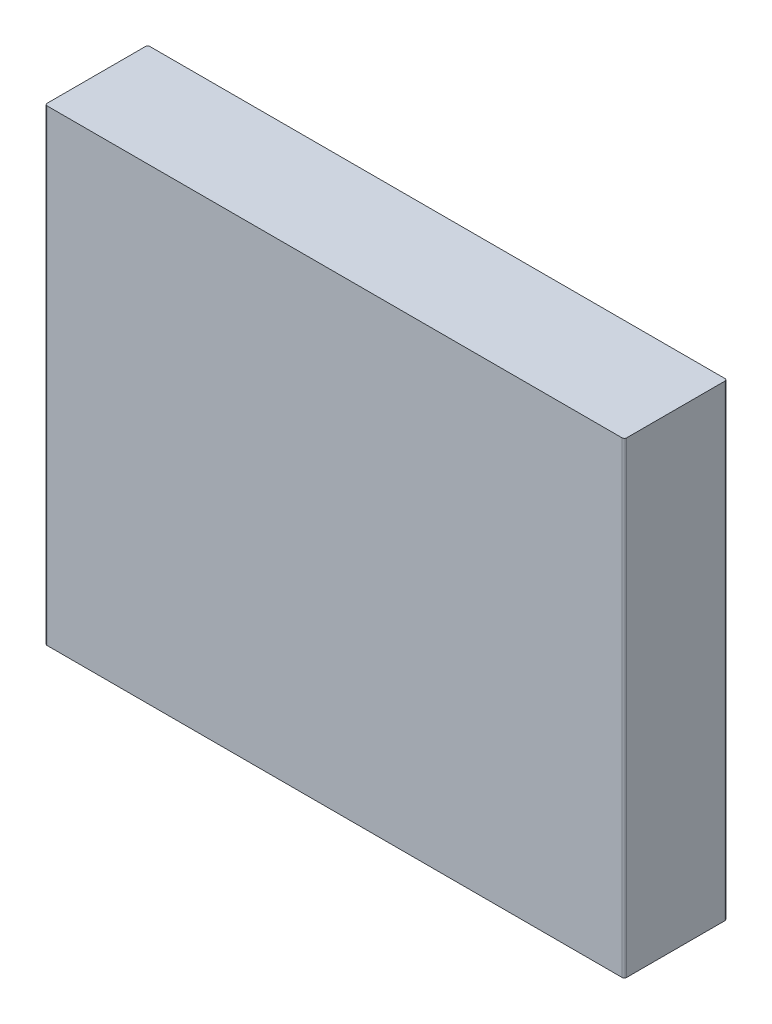
ISO-10303-21;
HEADER;
FILE_DESCRIPTION(('STEP AP214'),'2;1');
FILE_NAME('part.step','',(''),(''),'','','');
FILE_SCHEMA(('AUTOMOTIVE_DESIGN { 1 0 10303 214 1 1 1 1 }'));
ENDSEC;
DATA;
#1=APPLICATION_CONTEXT('core data for automotive mechanical design processes');
#2=APPLICATION_PROTOCOL_DEFINITION('international standard','automotive_design',2000,#1);
#3=PRODUCT_CONTEXT('',#1,'mechanical');
#4=PRODUCT('Part','Part','',(#3));
#5=PRODUCT_RELATED_PRODUCT_CATEGORY('part','',(#4));
#6=PRODUCT_DEFINITION_FORMATION('','',#4);
#7=PRODUCT_DEFINITION_CONTEXT('part definition',#1,'design');
#8=PRODUCT_DEFINITION('design','',#6,#7);
#9=PRODUCT_DEFINITION_SHAPE('','',#8);
#10=(LENGTH_UNIT() NAMED_UNIT(*) SI_UNIT(.MILLI.,.METRE.));
#11=(NAMED_UNIT(*) PLANE_ANGLE_UNIT() SI_UNIT($,.RADIAN.));
#12=(NAMED_UNIT(*) SI_UNIT($,.STERADIAN.) SOLID_ANGLE_UNIT());
#13=UNCERTAINTY_MEASURE_WITH_UNIT(LENGTH_MEASURE(1.E-05),#10,'distance_accuracy_value','');
#14=(GEOMETRIC_REPRESENTATION_CONTEXT(3) GLOBAL_UNCERTAINTY_ASSIGNED_CONTEXT((#13)) GLOBAL_UNIT_ASSIGNED_CONTEXT((#10,
#11,#12)) REPRESENTATION_CONTEXT('',''));
#15=CARTESIAN_POINT('',(0.,0.,0.));
#16=DIRECTION('',(0.,0.,1.));
#17=DIRECTION('',(1.,0.,0.));
#18=AXIS2_PLACEMENT_3D('',#15,#16,#17);
#19=CARTESIAN_POINT('',(0.,0.,0.6));
#20=DIRECTION('',(0.,0.,-1.));
#21=DIRECTION('',(0.,-1.,0.));
#22=AXIS2_PLACEMENT_3D('',#19,#20,#21);
#23=PLANE('',#22);
#24=DIRECTION('',(0.,1.,0.));
#25=VECTOR('',#24,1.);
#26=CARTESIAN_POINT('',(-1.5375,-0.625,0.6));
#27=LINE('',#26,#25);
#28=CARTESIAN_POINT('',(-1.5375,-1.25,0.6));
#29=VERTEX_POINT('',#28);
#30=CARTESIAN_POINT('',(-1.5375,1.25,0.6));
#31=VERTEX_POINT('',#30);
#32=EDGE_CURVE('E139',#29,#31,#27,.T.);
#33=ORIENTED_EDGE('',*,*,#32,.F.);
#34=DIRECTION('',(1.,0.,0.));
#35=VECTOR('',#34,1.);
#36=CARTESIAN_POINT('',(-1.55,-1.25,0.6));
#37=LINE('',#36,#35);
#38=CARTESIAN_POINT('',(1.5375,-1.25,0.6));
#39=VERTEX_POINT('',#38);
#40=EDGE_CURVE('E11',#29,#39,#37,.T.);
#41=ORIENTED_EDGE('',*,*,#40,.T.);
#42=DIRECTION('',(0.,-1.,0.));
#43=VECTOR('',#42,1.);
#44=CARTESIAN_POINT('',(1.5375,0.625,0.6));
#45=LINE('',#44,#43);
#46=CARTESIAN_POINT('',(1.5375,1.25,0.6));
#47=VERTEX_POINT('',#46);
#48=EDGE_CURVE('E141',#47,#39,#45,.T.);
#49=ORIENTED_EDGE('',*,*,#48,.F.);
#50=DIRECTION('',(-1.,0.,0.));
#51=VECTOR('',#50,1.);
#52=CARTESIAN_POINT('',(1.55,1.25,0.6));
#53=LINE('',#52,#51);
#54=EDGE_CURVE('E129',#47,#31,#53,.T.);
#55=ORIENTED_EDGE('',*,*,#54,.T.);
#56=EDGE_LOOP('',(#33,#41,#49,#55));
#57=FACE_BOUND('',#56,.T.);
#58=ADVANCED_FACE('F16',(#57),#23,.F.);
#59=CARTESIAN_POINT('',(1.55,-1.25,0.6));
#60=DIRECTION('',(0.,-1.,0.));
#61=DIRECTION('',(0.,0.,-1.));
#62=AXIS2_PLACEMENT_3D('',#59,#60,#61);
#63=PLANE('',#62);
#64=CARTESIAN_POINT('',(-1.5375,-1.25,0.5875));
#65=DIRECTION('',(0.,1.,0.));
#66=DIRECTION('',(-0.707106781186548,0.,0.707106781186548));
#67=AXIS2_PLACEMENT_3D('',#64,#65,#66);
#68=CIRCLE('',#67,0.0125);
#69=CARTESIAN_POINT('',(-1.55,-1.25,0.5875));
#70=VERTEX_POINT('',#69);
#71=EDGE_CURVE('E188',#70,#29,#68,.T.);
#72=ORIENTED_EDGE('',*,*,#71,.F.);
#73=DIRECTION('',(0.,0.,-1.));
#74=VECTOR('',#73,1.);
#75=CARTESIAN_POINT('',(-1.55,-1.25,0.6));
#76=LINE('',#75,#74);
#77=CARTESIAN_POINT('',(-1.55,-1.25,0.0625));
#78=VERTEX_POINT('',#77);
#79=EDGE_CURVE('E136',#70,#78,#76,.T.);
#80=ORIENTED_EDGE('',*,*,#79,.T.);
#81=CARTESIAN_POINT('',(-1.5375,-1.25,0.0625));
#82=DIRECTION('',(0.,1.,0.));
#83=DIRECTION('',(-0.707106781186548,0.,-0.707106781186548));
#84=AXIS2_PLACEMENT_3D('',#81,#82,#83);
#85=CIRCLE('',#84,0.0125);
#86=CARTESIAN_POINT('',(-1.5375,-1.25,0.05));
#87=VERTEX_POINT('',#86);
#88=EDGE_CURVE('E155',#87,#78,#85,.T.);
#89=ORIENTED_EDGE('',*,*,#88,.F.);
#90=DIRECTION('',(-1.,0.,0.));
#91=VECTOR('',#90,1.);
#92=CARTESIAN_POINT('',(-1.55,-1.25,0.05));
#93=LINE('',#92,#91);
#94=CARTESIAN_POINT('',(1.5375,-1.25,0.05));
#95=VERTEX_POINT('',#94);
#96=EDGE_CURVE('E154',#95,#87,#93,.T.);
#97=ORIENTED_EDGE('',*,*,#96,.F.);
#98=CARTESIAN_POINT('',(1.5375,-1.25,0.0625));
#99=DIRECTION('',(0.,1.,0.));
#100=DIRECTION('',(0.707106781186548,0.,-0.707106781186548));
#101=AXIS2_PLACEMENT_3D('',#98,#99,#100);
#102=CIRCLE('',#101,0.0125);
#103=CARTESIAN_POINT('',(1.55,-1.25,0.0625));
#104=VERTEX_POINT('',#103);
#105=EDGE_CURVE('E109',#104,#95,#102,.T.);
#106=ORIENTED_EDGE('',*,*,#105,.F.);
#107=DIRECTION('',(0.,0.,-1.));
#108=VECTOR('',#107,1.);
#109=CARTESIAN_POINT('',(1.55,-1.25,0.6));
#110=LINE('',#109,#108);
#111=CARTESIAN_POINT('',(1.55,-1.25,0.5875));
#112=VERTEX_POINT('',#111);
#113=EDGE_CURVE('E103',#112,#104,#110,.T.);
#114=ORIENTED_EDGE('',*,*,#113,.F.);
#115=CARTESIAN_POINT('',(1.5375,-1.25,0.5875));
#116=DIRECTION('',(0.,1.,0.));
#117=DIRECTION('',(0.707106781186548,0.,0.707106781186548));
#118=AXIS2_PLACEMENT_3D('',#115,#116,#117);
#119=CIRCLE('',#118,0.0125);
#120=EDGE_CURVE('E27',#39,#112,#119,.T.);
#121=ORIENTED_EDGE('',*,*,#120,.F.);
#122=ORIENTED_EDGE('',*,*,#40,.F.);
#123=EDGE_LOOP('',(#72,#80,#89,#97,#106,#114,#121,#122));
#124=FACE_BOUND('',#123,.T.);
#125=ADVANCED_FACE('F184',(#124),#63,.T.);
#126=CARTESIAN_POINT('',(1.5375,0.625,0.5875));
#127=DIRECTION('',(0.,1.,0.));
#128=DIRECTION('',(0.707106781186548,0.,0.707106781186548));
#129=AXIS2_PLACEMENT_3D('',#126,#127,#128);
#130=CYLINDRICAL_SURFACE('',#129,0.0125);
#131=CARTESIAN_POINT('',(1.5375,1.25,0.5875));
#132=DIRECTION('',(0.,-1.,0.));
#133=DIRECTION('',(0.707106781186548,0.,0.707106781186548));
#134=AXIS2_PLACEMENT_3D('',#131,#132,#133);
#135=CIRCLE('',#134,0.0125);
#136=CARTESIAN_POINT('',(1.55,1.25,0.5875));
#137=VERTEX_POINT('',#136);
#138=EDGE_CURVE('E123',#137,#47,#135,.T.);
#139=ORIENTED_EDGE('',*,*,#138,.T.);
#140=ORIENTED_EDGE('',*,*,#48,.T.);
#141=ORIENTED_EDGE('',*,*,#120,.T.);
#142=DIRECTION('',(0.,1.,0.));
#143=VECTOR('',#142,1.);
#144=CARTESIAN_POINT('',(1.55,0.625,0.5875));
#145=LINE('',#144,#143);
#146=EDGE_CURVE('E108',#112,#137,#145,.T.);
#147=ORIENTED_EDGE('',*,*,#146,.T.);
#148=EDGE_LOOP('',(#139,#140,#141,#147));
#149=FACE_BOUND('',#148,.T.);
#150=ADVANCED_FACE('F242',(#149),#130,.T.);
#151=CARTESIAN_POINT('',(1.55,1.25,0.6));
#152=DIRECTION('',(1.,0.,0.));
#153=DIRECTION('',(0.,0.,1.));
#154=AXIS2_PLACEMENT_3D('',#151,#152,#153);
#155=PLANE('',#154);
#156=DIRECTION('',(0.,-1.,0.));
#157=VECTOR('',#156,1.);
#158=CARTESIAN_POINT('',(1.55,0.625,0.0625));
#159=LINE('',#158,#157);
#160=CARTESIAN_POINT('',(1.55,1.25,0.0625));
#161=VERTEX_POINT('',#160);
#162=EDGE_CURVE('E96',#161,#104,#159,.T.);
#163=ORIENTED_EDGE('',*,*,#162,.F.);
#164=DIRECTION('',(0.,0.,-1.));
#165=VECTOR('',#164,1.);
#166=CARTESIAN_POINT('',(1.55,1.25,0.6));
#167=LINE('',#166,#165);
#168=EDGE_CURVE('E20',#137,#161,#167,.T.);
#169=ORIENTED_EDGE('',*,*,#168,.F.);
#170=ORIENTED_EDGE('',*,*,#146,.F.);
#171=ORIENTED_EDGE('',*,*,#113,.T.);
#172=EDGE_LOOP('',(#163,#169,#170,#171));
#173=FACE_BOUND('',#172,.T.);
#174=ADVANCED_FACE('F98',(#173),#155,.T.);
#175=CARTESIAN_POINT('',(1.5375,0.625,0.0625));
#176=DIRECTION('',(0.,-1.,0.));
#177=DIRECTION('',(0.707106781186548,0.,-0.707106781186548));
#178=AXIS2_PLACEMENT_3D('',#175,#176,#177);
#179=CYLINDRICAL_SURFACE('',#178,0.0125);
#180=ORIENTED_EDGE('',*,*,#105,.T.);
#181=DIRECTION('',(0.,1.,0.));
#182=VECTOR('',#181,1.);
#183=CARTESIAN_POINT('',(1.5375,0.625,0.05));
#184=LINE('',#183,#182);
#185=CARTESIAN_POINT('',(1.5375,1.25,0.05));
#186=VERTEX_POINT('',#185);
#187=EDGE_CURVE('E115',#95,#186,#184,.T.);
#188=ORIENTED_EDGE('',*,*,#187,.T.);
#189=CARTESIAN_POINT('',(1.5375,1.25,0.0625));
#190=DIRECTION('',(0.,-1.,0.));
#191=DIRECTION('',(0.707106781186548,0.,-0.707106781186548));
#192=AXIS2_PLACEMENT_3D('',#189,#190,#191);
#193=CIRCLE('',#192,0.0125);
#194=EDGE_CURVE('E112',#186,#161,#193,.T.);
#195=ORIENTED_EDGE('',*,*,#194,.T.);
#196=ORIENTED_EDGE('',*,*,#162,.T.);
#197=EDGE_LOOP('',(#180,#188,#195,#196));
#198=FACE_BOUND('',#197,.T.);
#199=ADVANCED_FACE('F113',(#198),#179,.T.);
#200=CARTESIAN_POINT('',(0.,0.,0.05));
#201=DIRECTION('',(0.,0.,-1.));
#202=DIRECTION('',(0.,-1.,0.));
#203=AXIS2_PLACEMENT_3D('',#200,#201,#202);
#204=PLANE('',#203);
#205=DIRECTION('',(0.,-1.,0.));
#206=VECTOR('',#205,1.);
#207=CARTESIAN_POINT('',(-1.5375,-0.625,0.05));
#208=LINE('',#207,#206);
#209=CARTESIAN_POINT('',(-1.5375,1.25,0.05));
#210=VERTEX_POINT('',#209);
#211=EDGE_CURVE('E158',#210,#87,#208,.T.);
#212=ORIENTED_EDGE('',*,*,#211,.F.);
#213=DIRECTION('',(1.,0.,0.));
#214=VECTOR('',#213,1.);
#215=CARTESIAN_POINT('',(1.55,1.25,0.05));
#216=LINE('',#215,#214);
#217=EDGE_CURVE('E118',#210,#186,#216,.T.);
#218=ORIENTED_EDGE('',*,*,#217,.T.);
#219=ORIENTED_EDGE('',*,*,#187,.F.);
#220=ORIENTED_EDGE('',*,*,#96,.T.);
#221=EDGE_LOOP('',(#212,#218,#219,#220));
#222=FACE_BOUND('',#221,.T.);
#223=ADVANCED_FACE('F196',(#222),#204,.T.);
#224=CARTESIAN_POINT('',(-1.5375,-0.625,0.0625));
#225=DIRECTION('',(0.,1.,0.));
#226=DIRECTION('',(-0.707106781186548,0.,-0.707106781186548));
#227=AXIS2_PLACEMENT_3D('',#224,#225,#226);
#228=CYLINDRICAL_SURFACE('',#227,0.0125);
#229=CARTESIAN_POINT('',(-1.5375,1.25,0.0625));
#230=DIRECTION('',(0.,-1.,0.));
#231=DIRECTION('',(-0.707106781186548,0.,-0.707106781186548));
#232=AXIS2_PLACEMENT_3D('',#229,#230,#231);
#233=CIRCLE('',#232,0.0125);
#234=CARTESIAN_POINT('',(-1.55,1.25,0.0625));
#235=VERTEX_POINT('',#234);
#236=EDGE_CURVE('E68',#235,#210,#233,.T.);
#237=ORIENTED_EDGE('',*,*,#236,.T.);
#238=ORIENTED_EDGE('',*,*,#211,.T.);
#239=ORIENTED_EDGE('',*,*,#88,.T.);
#240=DIRECTION('',(0.,1.,0.));
#241=VECTOR('',#240,1.);
#242=CARTESIAN_POINT('',(-1.55,-0.625,0.0625));
#243=LINE('',#242,#241);
#244=EDGE_CURVE('E162',#78,#235,#243,.T.);
#245=ORIENTED_EDGE('',*,*,#244,.T.);
#246=EDGE_LOOP('',(#237,#238,#239,#245));
#247=FACE_BOUND('',#246,.T.);
#248=ADVANCED_FACE('F192',(#247),#228,.T.);
#249=CARTESIAN_POINT('',(-1.55,1.25,0.6));
#250=DIRECTION('',(0.,1.,0.));
#251=DIRECTION('',(1.,0.,0.));
#252=AXIS2_PLACEMENT_3D('',#249,#250,#251);
#253=PLANE('',#252);
#254=CARTESIAN_POINT('',(-1.5375,1.25,0.5875));
#255=DIRECTION('',(0.,-1.,0.));
#256=DIRECTION('',(-0.707106781186548,0.,0.707106781186548));
#257=AXIS2_PLACEMENT_3D('',#254,#255,#256);
#258=CIRCLE('',#257,0.0125);
#259=CARTESIAN_POINT('',(-1.55,1.25,0.5875));
#260=VERTEX_POINT('',#259);
#261=EDGE_CURVE('E216',#31,#260,#258,.T.);
#262=ORIENTED_EDGE('',*,*,#261,.F.);
#263=ORIENTED_EDGE('',*,*,#54,.F.);
#264=ORIENTED_EDGE('',*,*,#138,.F.);
#265=ORIENTED_EDGE('',*,*,#168,.T.);
#266=ORIENTED_EDGE('',*,*,#194,.F.);
#267=ORIENTED_EDGE('',*,*,#217,.F.);
#268=ORIENTED_EDGE('',*,*,#236,.F.);
#269=DIRECTION('',(0.,0.,-1.));
#270=VECTOR('',#269,1.);
#271=CARTESIAN_POINT('',(-1.55,1.25,0.6));
#272=LINE('',#271,#270);
#273=EDGE_CURVE('E80',#260,#235,#272,.T.);
#274=ORIENTED_EDGE('',*,*,#273,.F.);
#275=EDGE_LOOP('',(#262,#263,#264,#265,#266,#267,#268,#274));
#276=FACE_BOUND('',#275,.T.);
#277=ADVANCED_FACE('F120',(#276),#253,.T.);
#278=CARTESIAN_POINT('',(-1.55,-1.25,0.6));
#279=DIRECTION('',(-1.,0.,0.));
#280=DIRECTION('',(0.,0.,1.));
#281=AXIS2_PLACEMENT_3D('',#278,#279,#280);
#282=PLANE('',#281);
#283=DIRECTION('',(0.,-1.,0.));
#284=VECTOR('',#283,1.);
#285=CARTESIAN_POINT('',(-1.55,-0.625,0.5875));
#286=LINE('',#285,#284);
#287=EDGE_CURVE('E174',#260,#70,#286,.T.);
#288=ORIENTED_EDGE('',*,*,#287,.F.);
#289=ORIENTED_EDGE('',*,*,#273,.T.);
#290=ORIENTED_EDGE('',*,*,#244,.F.);
#291=ORIENTED_EDGE('',*,*,#79,.F.);
#292=EDGE_LOOP('',(#288,#289,#290,#291));
#293=FACE_BOUND('',#292,.T.);
#294=ADVANCED_FACE('F18',(#293),#282,.T.);
#295=CARTESIAN_POINT('',(-1.5375,-0.625,0.5875));
#296=DIRECTION('',(0.,-1.,0.));
#297=DIRECTION('',(-0.707106781186548,0.,0.707106781186548));
#298=AXIS2_PLACEMENT_3D('',#295,#296,#297);
#299=CYLINDRICAL_SURFACE('',#298,0.0125);
#300=ORIENTED_EDGE('',*,*,#71,.T.);
#301=ORIENTED_EDGE('',*,*,#32,.T.);
#302=ORIENTED_EDGE('',*,*,#261,.T.);
#303=ORIENTED_EDGE('',*,*,#287,.T.);
#304=EDGE_LOOP('',(#300,#301,#302,#303));
#305=FACE_BOUND('',#304,.T.);
#306=ADVANCED_FACE('F220',(#305),#299,.T.);
#307=CLOSED_SHELL('',(#58,#125,#150,#174,#199,#223,#248,#277,#294,#306));
#308=MANIFOLD_SOLID_BREP('B1',#307);
#309=ADVANCED_BREP_SHAPE_REPRESENTATION('',(#18,#308),#14);
#310=SHAPE_DEFINITION_REPRESENTATION(#9,#309);
ENDSEC;
END-ISO-10303-21;
